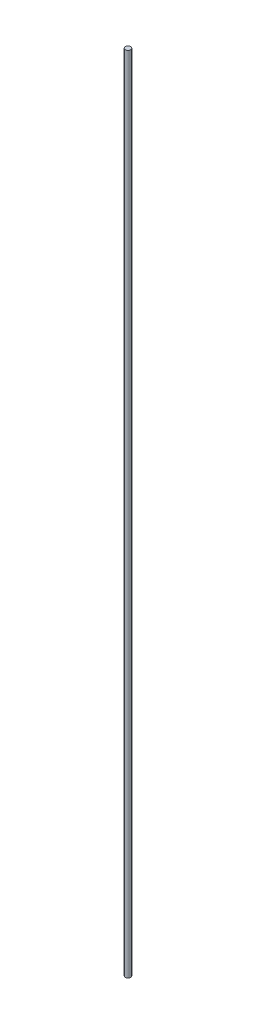
ISO-10303-21;
HEADER;
FILE_DESCRIPTION(('STEP AP214'),'2;1');
FILE_NAME('part.step','',(''),(''),'','','');
FILE_SCHEMA(('AUTOMOTIVE_DESIGN { 1 0 10303 214 1 1 1 1 }'));
ENDSEC;
DATA;
#1=APPLICATION_CONTEXT('core data for automotive mechanical design processes');
#2=APPLICATION_PROTOCOL_DEFINITION('international standard','automotive_design',2000,#1);
#3=PRODUCT_CONTEXT('',#1,'mechanical');
#4=PRODUCT('Part','Part','',(#3));
#5=PRODUCT_RELATED_PRODUCT_CATEGORY('part','',(#4));
#6=PRODUCT_DEFINITION_FORMATION('','',#4);
#7=PRODUCT_DEFINITION_CONTEXT('part definition',#1,'design');
#8=PRODUCT_DEFINITION('design','',#6,#7);
#9=PRODUCT_DEFINITION_SHAPE('','',#8);
#10=(LENGTH_UNIT() NAMED_UNIT(*) SI_UNIT(.MILLI.,.METRE.));
#11=(NAMED_UNIT(*) PLANE_ANGLE_UNIT() SI_UNIT($,.RADIAN.));
#12=(NAMED_UNIT(*) SI_UNIT($,.STERADIAN.) SOLID_ANGLE_UNIT());
#13=UNCERTAINTY_MEASURE_WITH_UNIT(LENGTH_MEASURE(1.E-05),#10,'distance_accuracy_value','');
#14=(GEOMETRIC_REPRESENTATION_CONTEXT(3) GLOBAL_UNCERTAINTY_ASSIGNED_CONTEXT((#13)) GLOBAL_UNIT_ASSIGNED_CONTEXT((#10,
#11,#12)) REPRESENTATION_CONTEXT('',''));
#15=CARTESIAN_POINT('',(0.,0.,0.));
#16=DIRECTION('',(0.,0.,1.));
#17=DIRECTION('',(1.,0.,0.));
#18=AXIS2_PLACEMENT_3D('',#15,#16,#17);
#19=CARTESIAN_POINT('',(0.,0.,0.));
#20=DIRECTION('',(0.,1.,0.));
#21=DIRECTION('',(0.,0.,1.));
#22=AXIS2_PLACEMENT_3D('',#19,#20,#21);
#23=PLANE('',#22);
#24=CARTESIAN_POINT('',(0.,0.,0.));
#25=DIRECTION('',(0.,1.,0.));
#26=DIRECTION('',(0.,0.,1.));
#27=AXIS2_PLACEMENT_3D('',#24,#25,#26);
#28=CIRCLE('',#27,6.35);
#29=CARTESIAN_POINT('',(0.,0.,6.35));
#30=VERTEX_POINT('',#29);
#31=EDGE_CURVE('E47',#30,#30,#28,.T.);
#32=ORIENTED_EDGE('',*,*,#31,.F.);
#33=EDGE_LOOP('',(#32));
#34=FACE_BOUND('',#33,.T.);
#35=ADVANCED_FACE('F41',(#34),#23,.F.);
#36=CARTESIAN_POINT('',(0.,1885.696,0.));
#37=DIRECTION('',(0.,1.,0.));
#38=DIRECTION('',(0.,0.,1.));
#39=AXIS2_PLACEMENT_3D('',#36,#37,#38);
#40=PLANE('',#39);
#41=CARTESIAN_POINT('',(0.,1885.696,0.));
#42=DIRECTION('',(0.,1.,0.));
#43=DIRECTION('',(0.,0.,1.));
#44=AXIS2_PLACEMENT_3D('',#41,#42,#43);
#45=CIRCLE('',#44,6.35);
#46=CARTESIAN_POINT('',(0.,1885.696,6.35));
#47=VERTEX_POINT('',#46);
#48=EDGE_CURVE('E11',#47,#47,#45,.T.);
#49=ORIENTED_EDGE('',*,*,#48,.T.);
#50=EDGE_LOOP('',(#49));
#51=FACE_BOUND('',#50,.T.);
#52=ADVANCED_FACE('F56',(#51),#40,.T.);
#53=CARTESIAN_POINT('',(0.,0.,0.));
#54=DIRECTION('',(0.,1.,0.));
#55=DIRECTION('',(0.,0.,1.));
#56=AXIS2_PLACEMENT_3D('',#53,#54,#55);
#57=CYLINDRICAL_SURFACE('',#56,6.35);
#58=ORIENTED_EDGE('',*,*,#48,.F.);
#59=EDGE_LOOP('',(#58));
#60=FACE_BOUND('',#59,.T.);
#61=ORIENTED_EDGE('',*,*,#31,.T.);
#62=EDGE_LOOP('',(#61));
#63=FACE_BOUND('',#62,.T.);
#64=ADVANCED_FACE('F53',(#60,#63),#57,.T.);
#65=CLOSED_SHELL('',(#35,#52,#64));
#66=MANIFOLD_SOLID_BREP('B2',#65);
#67=ADVANCED_BREP_SHAPE_REPRESENTATION('',(#18,#66),#14);
#68=SHAPE_DEFINITION_REPRESENTATION(#9,#67);
ENDSEC;
END-ISO-10303-21;
